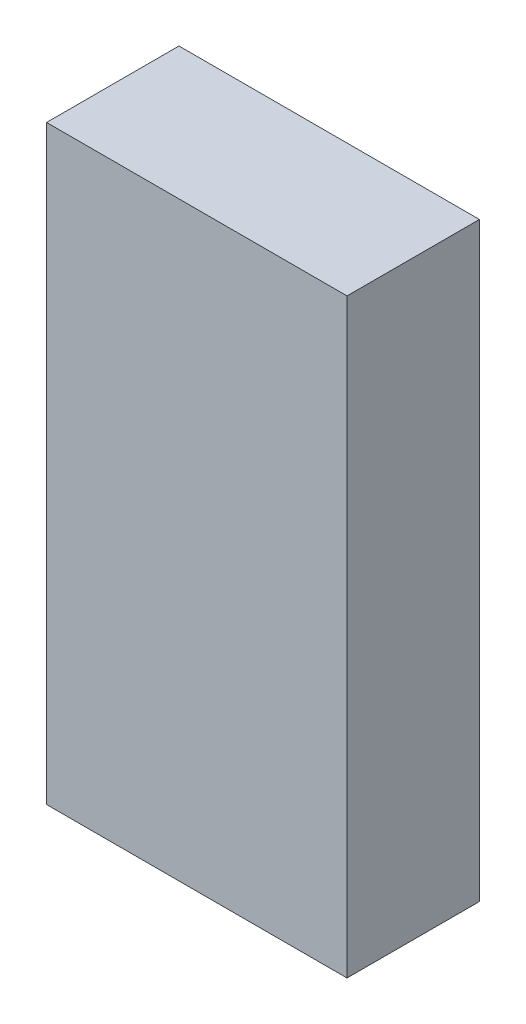
ISO-10303-21;
HEADER;
FILE_DESCRIPTION(('STEP AP214'),'2;1');
FILE_NAME('part.step','',(''),(''),'','','');
FILE_SCHEMA(('AUTOMOTIVE_DESIGN { 1 0 10303 214 1 1 1 1 }'));
ENDSEC;
DATA;
#1=APPLICATION_CONTEXT('core data for automotive mechanical design processes');
#2=APPLICATION_PROTOCOL_DEFINITION('international standard','automotive_design',2000,#1);
#3=PRODUCT_CONTEXT('',#1,'mechanical');
#4=PRODUCT('Part','Part','',(#3));
#5=PRODUCT_RELATED_PRODUCT_CATEGORY('part','',(#4));
#6=PRODUCT_DEFINITION_FORMATION('','',#4);
#7=PRODUCT_DEFINITION_CONTEXT('part definition',#1,'design');
#8=PRODUCT_DEFINITION('design','',#6,#7);
#9=PRODUCT_DEFINITION_SHAPE('','',#8);
#10=(LENGTH_UNIT() NAMED_UNIT(*) SI_UNIT(.MILLI.,.METRE.));
#11=(NAMED_UNIT(*) PLANE_ANGLE_UNIT() SI_UNIT($,.RADIAN.));
#12=(NAMED_UNIT(*) SI_UNIT($,.STERADIAN.) SOLID_ANGLE_UNIT());
#13=UNCERTAINTY_MEASURE_WITH_UNIT(LENGTH_MEASURE(1.E-05),#10,'distance_accuracy_value','');
#14=(GEOMETRIC_REPRESENTATION_CONTEXT(3) GLOBAL_UNCERTAINTY_ASSIGNED_CONTEXT((#13)) GLOBAL_UNIT_ASSIGNED_CONTEXT((#10,
#11,#12)) REPRESENTATION_CONTEXT('',''));
#15=CARTESIAN_POINT('',(0.,0.,0.));
#16=DIRECTION('',(0.,0.,1.));
#17=DIRECTION('',(1.,0.,0.));
#18=AXIS2_PLACEMENT_3D('',#15,#16,#17);
#19=CARTESIAN_POINT('',(1.47500086,2.90000182,1.29999994));
#20=DIRECTION('',(0.,0.,1.));
#21=DIRECTION('',(1.,0.,0.));
#22=AXIS2_PLACEMENT_3D('',#19,#20,#21);
#23=PLANE('',#22);
#24=DIRECTION('',(1.,0.,0.));
#25=VECTOR('',#24,1.);
#26=CARTESIAN_POINT('',(1.47500086,-2.89999928,1.29999994));
#27=LINE('',#26,#25);
#28=CARTESIAN_POINT('',(1.47500086,-2.89999928,1.29999994));
#29=VERTEX_POINT('',#28);
#30=CARTESIAN_POINT('',(-1.47500086,-2.89999928,1.29999994));
#31=VERTEX_POINT('',#30);
#32=EDGE_CURVE('E52',#29,#31,#27,.F.);
#33=ORIENTED_EDGE('',*,*,#32,.F.);
#34=DIRECTION('',(0.,1.,0.));
#35=VECTOR('',#34,1.);
#36=CARTESIAN_POINT('',(1.47500086,2.90000182,1.29999994));
#37=LINE('',#36,#35);
#38=CARTESIAN_POINT('',(1.47500086,2.90000182,1.29999994));
#39=VERTEX_POINT('',#38);
#40=EDGE_CURVE('E67',#39,#29,#37,.F.);
#41=ORIENTED_EDGE('',*,*,#40,.F.);
#42=DIRECTION('',(1.,0.,0.));
#43=VECTOR('',#42,1.);
#44=CARTESIAN_POINT('',(-1.47500086,2.90000182,1.29999994));
#45=LINE('',#44,#43);
#46=CARTESIAN_POINT('',(-1.47500086,2.90000182,1.29999994));
#47=VERTEX_POINT('',#46);
#48=EDGE_CURVE('E19',#47,#39,#45,.T.);
#49=ORIENTED_EDGE('',*,*,#48,.F.);
#50=DIRECTION('',(0.,1.,0.));
#51=VECTOR('',#50,1.);
#52=CARTESIAN_POINT('',(-1.47500086,-2.89999928,1.29999994));
#53=LINE('',#52,#51);
#54=EDGE_CURVE('E57',#31,#47,#53,.T.);
#55=ORIENTED_EDGE('',*,*,#54,.F.);
#56=EDGE_LOOP('',(#33,#41,#49,#55));
#57=FACE_BOUND('',#56,.T.);
#58=ADVANCED_FACE('F16',(#57),#23,.T.);
#59=CARTESIAN_POINT('',(-1.47500086,2.90000182,0.));
#60=DIRECTION('',(0.,1.,0.));
#61=DIRECTION('',(0.,0.,1.));
#62=AXIS2_PLACEMENT_3D('',#59,#60,#61);
#63=PLANE('',#62);
#64=DIRECTION('',(0.,0.,-1.));
#65=VECTOR('',#64,1.);
#66=CARTESIAN_POINT('',(1.47500086,2.90000182,0.));
#67=LINE('',#66,#65);
#68=CARTESIAN_POINT('',(1.47500086,2.90000182,0.));
#69=VERTEX_POINT('',#68);
#70=EDGE_CURVE('E78',#69,#39,#67,.F.);
#71=ORIENTED_EDGE('',*,*,#70,.F.);
#72=DIRECTION('',(1.,0.,0.));
#73=VECTOR('',#72,1.);
#74=CARTESIAN_POINT('',(1.47500086,2.90000182,0.));
#75=LINE('',#74,#73);
#76=CARTESIAN_POINT('',(-1.47500086,2.90000182,0.));
#77=VERTEX_POINT('',#76);
#78=EDGE_CURVE('E73',#69,#77,#75,.F.);
#79=ORIENTED_EDGE('',*,*,#78,.T.);
#80=DIRECTION('',(0.,0.,1.));
#81=VECTOR('',#80,1.);
#82=CARTESIAN_POINT('',(-1.47500086,2.90000182,0.));
#83=LINE('',#82,#81);
#84=EDGE_CURVE('E62',#47,#77,#83,.F.);
#85=ORIENTED_EDGE('',*,*,#84,.F.);
#86=ORIENTED_EDGE('',*,*,#48,.T.);
#87=EDGE_LOOP('',(#71,#79,#85,#86));
#88=FACE_BOUND('',#87,.T.);
#89=ADVANCED_FACE('F72',(#88),#63,.T.);
#90=CARTESIAN_POINT('',(-1.47500086,-2.89999928,0.));
#91=DIRECTION('',(-1.,0.,0.));
#92=DIRECTION('',(0.,0.,1.));
#93=AXIS2_PLACEMENT_3D('',#90,#91,#92);
#94=PLANE('',#93);
#95=ORIENTED_EDGE('',*,*,#84,.T.);
#96=DIRECTION('',(0.,1.,0.));
#97=VECTOR('',#96,1.);
#98=CARTESIAN_POINT('',(-1.47500086,2.90000182,0.));
#99=LINE('',#98,#97);
#100=CARTESIAN_POINT('',(-1.47500086,-2.89999928,0.));
#101=VERTEX_POINT('',#100);
#102=EDGE_CURVE('E83',#77,#101,#99,.F.);
#103=ORIENTED_EDGE('',*,*,#102,.T.);
#104=DIRECTION('',(0.,0.,-1.));
#105=VECTOR('',#104,1.);
#106=CARTESIAN_POINT('',(-1.47500086,-2.89999928,0.));
#107=LINE('',#106,#105);
#108=EDGE_CURVE('E64',#31,#101,#107,.T.);
#109=ORIENTED_EDGE('',*,*,#108,.F.);
#110=ORIENTED_EDGE('',*,*,#54,.T.);
#111=EDGE_LOOP('',(#95,#103,#109,#110));
#112=FACE_BOUND('',#111,.T.);
#113=ADVANCED_FACE('F59',(#112),#94,.T.);
#114=CARTESIAN_POINT('',(1.47500086,-2.89999928,0.));
#115=DIRECTION('',(0.,-1.,0.));
#116=DIRECTION('',(0.,0.,-1.));
#117=AXIS2_PLACEMENT_3D('',#114,#115,#116);
#118=PLANE('',#117);
#119=ORIENTED_EDGE('',*,*,#108,.T.);
#120=DIRECTION('',(1.,0.,0.));
#121=VECTOR('',#120,1.);
#122=CARTESIAN_POINT('',(1.47500086,-2.89999928,0.));
#123=LINE('',#122,#121);
#124=CARTESIAN_POINT('',(1.47500086,-2.89999928,0.));
#125=VERTEX_POINT('',#124);
#126=EDGE_CURVE('E25',#101,#125,#123,.T.);
#127=ORIENTED_EDGE('',*,*,#126,.T.);
#128=DIRECTION('',(0.,0.,-1.));
#129=VECTOR('',#128,1.);
#130=CARTESIAN_POINT('',(1.47500086,-2.89999928,0.));
#131=LINE('',#130,#129);
#132=EDGE_CURVE('E33',#29,#125,#131,.T.);
#133=ORIENTED_EDGE('',*,*,#132,.F.);
#134=ORIENTED_EDGE('',*,*,#32,.T.);
#135=EDGE_LOOP('',(#119,#127,#133,#134));
#136=FACE_BOUND('',#135,.T.);
#137=ADVANCED_FACE('F87',(#136),#118,.T.);
#138=CARTESIAN_POINT('',(1.47500086,2.90000182,0.));
#139=DIRECTION('',(1.,0.,0.));
#140=DIRECTION('',(0.,0.,-1.));
#141=AXIS2_PLACEMENT_3D('',#138,#139,#140);
#142=PLANE('',#141);
#143=ORIENTED_EDGE('',*,*,#132,.T.);
#144=DIRECTION('',(0.,1.,0.));
#145=VECTOR('',#144,1.);
#146=CARTESIAN_POINT('',(1.47500086,2.90000182,0.));
#147=LINE('',#146,#145);
#148=EDGE_CURVE('E11',#125,#69,#147,.T.);
#149=ORIENTED_EDGE('',*,*,#148,.T.);
#150=ORIENTED_EDGE('',*,*,#70,.T.);
#151=ORIENTED_EDGE('',*,*,#40,.T.);
#152=EDGE_LOOP('',(#143,#149,#150,#151));
#153=FACE_BOUND('',#152,.T.);
#154=ADVANCED_FACE('F90',(#153),#142,.T.);
#155=CARTESIAN_POINT('',(1.47500086,2.90000182,0.));
#156=DIRECTION('',(0.,0.,1.));
#157=DIRECTION('',(1.,0.,0.));
#158=AXIS2_PLACEMENT_3D('',#155,#156,#157);
#159=PLANE('',#158);
#160=ORIENTED_EDGE('',*,*,#126,.F.);
#161=ORIENTED_EDGE('',*,*,#102,.F.);
#162=ORIENTED_EDGE('',*,*,#78,.F.);
#163=ORIENTED_EDGE('',*,*,#148,.F.);
#164=EDGE_LOOP('',(#160,#161,#162,#163));
#165=FACE_BOUND('',#164,.T.);
#166=ADVANCED_FACE('F89',(#165),#159,.F.);
#167=CLOSED_SHELL('',(#58,#89,#113,#137,#154,#166));
#168=MANIFOLD_SOLID_BREP('B1',#167);
#169=ADVANCED_BREP_SHAPE_REPRESENTATION('',(#18,#168),#14);
#170=SHAPE_DEFINITION_REPRESENTATION(#9,#169);
ENDSEC;
END-ISO-10303-21;
